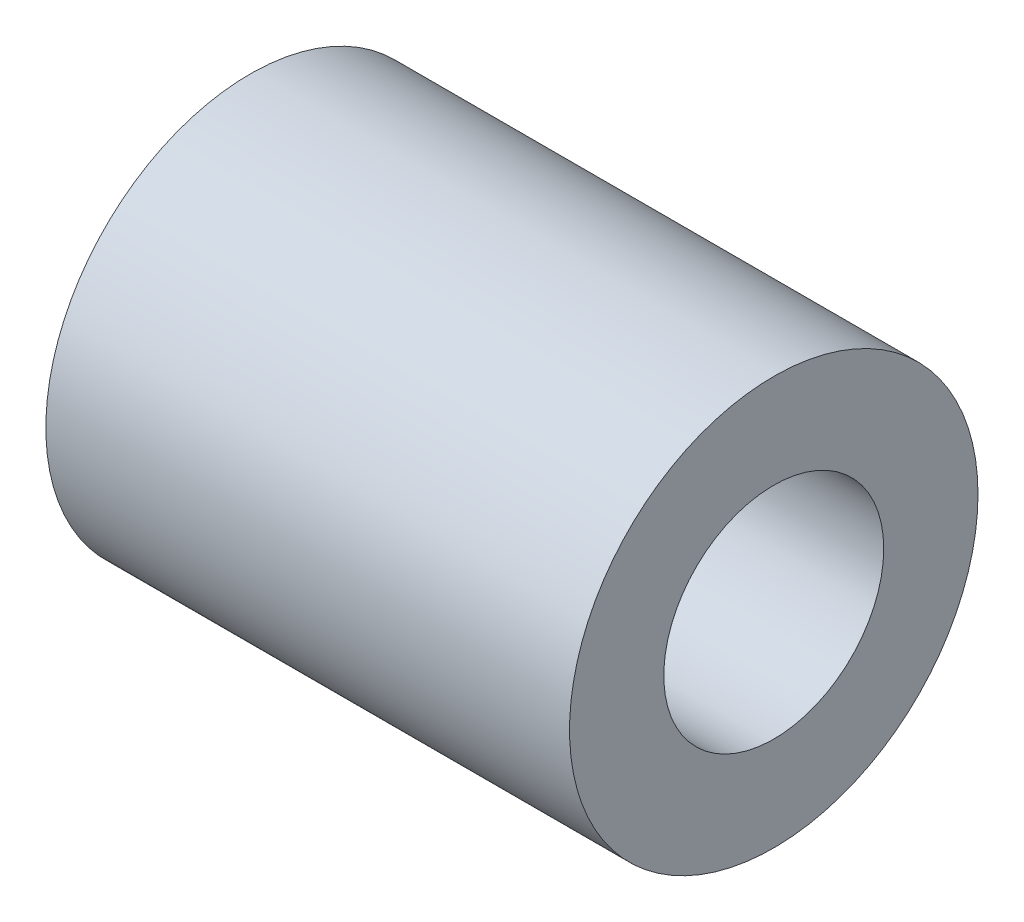
ISO-10303-21;
HEADER;
FILE_DESCRIPTION(('STEP AP214'),'2;1');
FILE_NAME('part.step','',(''),(''),'','','');
FILE_SCHEMA(('AUTOMOTIVE_DESIGN { 1 0 10303 214 1 1 1 1 }'));
ENDSEC;
DATA;
#1=APPLICATION_CONTEXT('core data for automotive mechanical design processes');
#2=APPLICATION_PROTOCOL_DEFINITION('international standard','automotive_design',2000,#1);
#3=PRODUCT_CONTEXT('',#1,'mechanical');
#4=PRODUCT('Part','Part','',(#3));
#5=PRODUCT_RELATED_PRODUCT_CATEGORY('part','',(#4));
#6=PRODUCT_DEFINITION_FORMATION('','',#4);
#7=PRODUCT_DEFINITION_CONTEXT('part definition',#1,'design');
#8=PRODUCT_DEFINITION('design','',#6,#7);
#9=PRODUCT_DEFINITION_SHAPE('','',#8);
#10=(LENGTH_UNIT() NAMED_UNIT(*) SI_UNIT(.MILLI.,.METRE.));
#11=(NAMED_UNIT(*) PLANE_ANGLE_UNIT() SI_UNIT($,.RADIAN.));
#12=(NAMED_UNIT(*) SI_UNIT($,.STERADIAN.) SOLID_ANGLE_UNIT());
#13=UNCERTAINTY_MEASURE_WITH_UNIT(LENGTH_MEASURE(1.E-05),#10,'distance_accuracy_value','');
#14=(GEOMETRIC_REPRESENTATION_CONTEXT(3) GLOBAL_UNCERTAINTY_ASSIGNED_CONTEXT((#13)) GLOBAL_UNIT_ASSIGNED_CONTEXT((#10,
#11,#12)) REPRESENTATION_CONTEXT('',''));
#15=CARTESIAN_POINT('',(0.,0.,0.));
#16=DIRECTION('',(0.,0.,1.));
#17=DIRECTION('',(1.,0.,0.));
#18=AXIS2_PLACEMENT_3D('',#15,#16,#17);
#19=CARTESIAN_POINT('',(15.,0.,0.));
#20=DIRECTION('',(1.,0.,0.));
#21=DIRECTION('',(0.,0.,-1.));
#22=AXIS2_PLACEMENT_3D('',#19,#20,#21);
#23=PLANE('',#22);
#24=CARTESIAN_POINT('',(15.,0.,0.));
#25=DIRECTION('',(1.,0.,0.));
#26=DIRECTION('',(0.,0.,-1.));
#27=AXIS2_PLACEMENT_3D('',#24,#25,#26);
#28=CIRCLE('',#27,5.85);
#29=CARTESIAN_POINT('',(15.,0.,-5.85));
#30=VERTEX_POINT('',#29);
#31=EDGE_CURVE('E10',#30,#30,#28,.T.);
#32=ORIENTED_EDGE('',*,*,#31,.T.);
#33=EDGE_LOOP('',(#32));
#34=FACE_BOUND('',#33,.T.);
#35=CARTESIAN_POINT('',(15.,0.,0.));
#36=DIRECTION('',(1.,0.,0.));
#37=DIRECTION('',(0.,0.,-1.));
#38=AXIS2_PLACEMENT_3D('',#35,#36,#37);
#39=CIRCLE('',#38,3.15);
#40=CARTESIAN_POINT('',(15.,0.,-3.15));
#41=VERTEX_POINT('',#40);
#42=EDGE_CURVE('E48',#41,#41,#39,.T.);
#43=ORIENTED_EDGE('',*,*,#42,.F.);
#44=EDGE_LOOP('',(#43));
#45=FACE_BOUND('',#44,.T.);
#46=ADVANCED_FACE('F37',(#34,#45),#23,.T.);
#47=CARTESIAN_POINT('',(0.,0.,0.));
#48=DIRECTION('',(1.,0.,0.));
#49=DIRECTION('',(0.,0.,-1.));
#50=AXIS2_PLACEMENT_3D('',#47,#48,#49);
#51=PLANE('',#50);
#52=CARTESIAN_POINT('',(0.,0.,0.));
#53=DIRECTION('',(1.,0.,0.));
#54=DIRECTION('',(0.,0.,-1.));
#55=AXIS2_PLACEMENT_3D('',#52,#53,#54);
#56=CIRCLE('',#55,5.85);
#57=CARTESIAN_POINT('',(0.,0.,-5.85));
#58=VERTEX_POINT('',#57);
#59=EDGE_CURVE('E41',#58,#58,#56,.T.);
#60=ORIENTED_EDGE('',*,*,#59,.F.);
#61=EDGE_LOOP('',(#60));
#62=FACE_BOUND('',#61,.T.);
#63=CARTESIAN_POINT('',(0.,0.,0.));
#64=DIRECTION('',(1.,0.,0.));
#65=DIRECTION('',(0.,0.,-1.));
#66=AXIS2_PLACEMENT_3D('',#63,#64,#65);
#67=CIRCLE('',#66,3.15);
#68=CARTESIAN_POINT('',(0.,0.,-3.15));
#69=VERTEX_POINT('',#68);
#70=EDGE_CURVE('E50',#69,#69,#67,.T.);
#71=ORIENTED_EDGE('',*,*,#70,.T.);
#72=EDGE_LOOP('',(#71));
#73=FACE_BOUND('',#72,.T.);
#74=ADVANCED_FACE('F60',(#62,#73),#51,.F.);
#75=CARTESIAN_POINT('',(15.,0.,0.));
#76=DIRECTION('',(-1.,0.,0.));
#77=DIRECTION('',(0.,0.,1.));
#78=AXIS2_PLACEMENT_3D('',#75,#76,#77);
#79=CYLINDRICAL_SURFACE('',#78,5.85);
#80=ORIENTED_EDGE('',*,*,#31,.F.);
#81=EDGE_LOOP('',(#80));
#82=FACE_BOUND('',#81,.T.);
#83=ORIENTED_EDGE('',*,*,#59,.T.);
#84=EDGE_LOOP('',(#83));
#85=FACE_BOUND('',#84,.T.);
#86=ADVANCED_FACE('F39',(#82,#85),#79,.T.);
#87=CARTESIAN_POINT('',(15.,0.,0.));
#88=DIRECTION('',(-1.,0.,0.));
#89=DIRECTION('',(0.,0.,1.));
#90=AXIS2_PLACEMENT_3D('',#87,#88,#89);
#91=CYLINDRICAL_SURFACE('',#90,3.15);
#92=ORIENTED_EDGE('',*,*,#42,.T.);
#93=EDGE_LOOP('',(#92));
#94=FACE_BOUND('',#93,.T.);
#95=ORIENTED_EDGE('',*,*,#70,.F.);
#96=EDGE_LOOP('',(#95));
#97=FACE_BOUND('',#96,.T.);
#98=ADVANCED_FACE('F56',(#94,#97),#91,.F.);
#99=CLOSED_SHELL('',(#46,#74,#86,#98));
#100=MANIFOLD_SOLID_BREP('B2',#99);
#101=ADVANCED_BREP_SHAPE_REPRESENTATION('',(#18,#100),#14);
#102=SHAPE_DEFINITION_REPRESENTATION(#9,#101);
ENDSEC;
END-ISO-10303-21;
